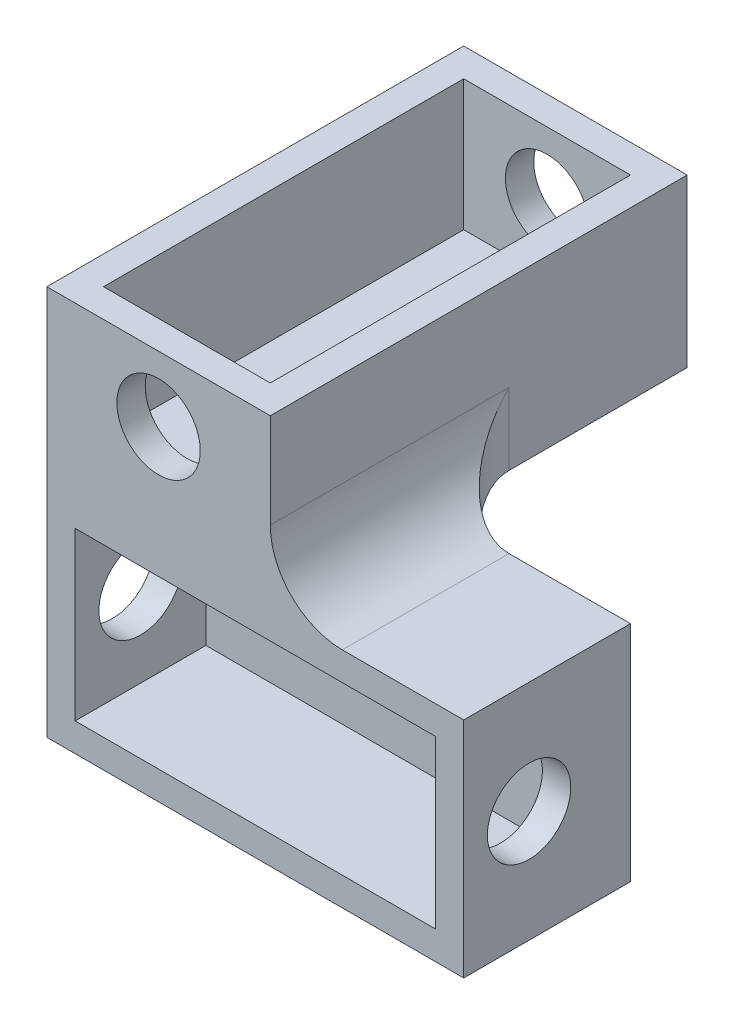
ISO-10303-21;
HEADER;
FILE_DESCRIPTION(('STEP AP214'),'2;1');
FILE_NAME('part.step','',(''),(''),'','','');
FILE_SCHEMA(('AUTOMOTIVE_DESIGN { 1 0 10303 214 1 1 1 1 }'));
ENDSEC;
DATA;
#1=APPLICATION_CONTEXT('core data for automotive mechanical design processes');
#2=APPLICATION_PROTOCOL_DEFINITION('international standard','automotive_design',2000,#1);
#3=PRODUCT_CONTEXT('',#1,'mechanical');
#4=PRODUCT('Part','Part','',(#3));
#5=PRODUCT_RELATED_PRODUCT_CATEGORY('part','',(#4));
#6=PRODUCT_DEFINITION_FORMATION('','',#4);
#7=PRODUCT_DEFINITION_CONTEXT('part definition',#1,'design');
#8=PRODUCT_DEFINITION('design','',#6,#7);
#9=PRODUCT_DEFINITION_SHAPE('','',#8);
#10=(LENGTH_UNIT() NAMED_UNIT(*) SI_UNIT(.MILLI.,.METRE.));
#11=(NAMED_UNIT(*) PLANE_ANGLE_UNIT() SI_UNIT($,.RADIAN.));
#12=(NAMED_UNIT(*) SI_UNIT($,.STERADIAN.) SOLID_ANGLE_UNIT());
#13=UNCERTAINTY_MEASURE_WITH_UNIT(LENGTH_MEASURE(1.E-05),#10,'distance_accuracy_value','');
#14=(GEOMETRIC_REPRESENTATION_CONTEXT(3) GLOBAL_UNCERTAINTY_ASSIGNED_CONTEXT((#13)) GLOBAL_UNIT_ASSIGNED_CONTEXT((#10,
#11,#12)) REPRESENTATION_CONTEXT('',''));
#15=CARTESIAN_POINT('',(0.,0.,0.));
#16=DIRECTION('',(0.,0.,1.));
#17=DIRECTION('',(1.,0.,0.));
#18=AXIS2_PLACEMENT_3D('',#15,#16,#17);
#19=CARTESIAN_POINT('',(-15.875,7.350000032,-3.425));
#20=DIRECTION('',(0.,-1.,0.));
#21=DIRECTION('',(0.,0.,-1.));
#22=AXIS2_PLACEMENT_3D('',#19,#20,#21);
#23=PLANE('',#22);
#24=DIRECTION('',(-1.,0.,0.));
#25=VECTOR('',#24,1.);
#26=CARTESIAN_POINT('',(-15.875,7.350000032,-14.95));
#27=LINE('',#26,#25);
#28=CARTESIAN_POINT('',(15.875,7.350000032,-14.95));
#29=VERTEX_POINT('',#28);
#30=CARTESIAN_POINT('',(-15.875,7.350000032,-14.95));
#31=VERTEX_POINT('',#30);
#32=EDGE_CURVE('E313',#29,#31,#27,.T.);
#33=ORIENTED_EDGE('',*,*,#32,.F.);
#34=DIRECTION('',(0.,0.,-1.));
#35=VECTOR('',#34,1.);
#36=CARTESIAN_POINT('',(15.875,7.350000032,-3.425));
#37=LINE('',#36,#35);
#38=CARTESIAN_POINT('',(15.875,7.350000032,-3.425));
#39=VERTEX_POINT('',#38);
#40=EDGE_CURVE('E334',#39,#29,#37,.T.);
#41=ORIENTED_EDGE('',*,*,#40,.F.);
#42=DIRECTION('',(-1.,0.,0.));
#43=VECTOR('',#42,1.);
#44=CARTESIAN_POINT('',(-15.875,7.350000032,-3.425));
#45=LINE('',#44,#43);
#46=CARTESIAN_POINT('',(-15.875,7.350000032,-3.425));
#47=VERTEX_POINT('',#46);
#48=EDGE_CURVE('E298',#39,#47,#45,.T.);
#49=ORIENTED_EDGE('',*,*,#48,.T.);
#50=DIRECTION('',(0.,0.,-1.));
#51=VECTOR('',#50,1.);
#52=CARTESIAN_POINT('',(-15.875,7.350000032,-3.425));
#53=LINE('',#52,#51);
#54=EDGE_CURVE('E331',#47,#31,#53,.T.);
#55=ORIENTED_EDGE('',*,*,#54,.T.);
#56=EDGE_LOOP('',(#33,#41,#49,#55));
#57=FACE_BOUND('',#56,.T.);
#58=ADVANCED_FACE('F42',(#57),#23,.T.);
#59=CARTESIAN_POINT('',(-15.875,-7.350000032,-3.425));
#60=DIRECTION('',(0.,1.,0.));
#61=DIRECTION('',(0.,0.,1.));
#62=AXIS2_PLACEMENT_3D('',#59,#60,#61);
#63=PLANE('',#62);
#64=DIRECTION('',(1.,0.,0.));
#65=VECTOR('',#64,1.);
#66=CARTESIAN_POINT('',(-15.875,-7.350000032,-14.95));
#67=LINE('',#66,#65);
#68=CARTESIAN_POINT('',(-15.875,-7.350000032,-14.95));
#69=VERTEX_POINT('',#68);
#70=CARTESIAN_POINT('',(15.875,-7.350000032,-14.95));
#71=VERTEX_POINT('',#70);
#72=EDGE_CURVE('E299',#69,#71,#67,.T.);
#73=ORIENTED_EDGE('',*,*,#72,.F.);
#74=DIRECTION('',(0.,0.,-1.));
#75=VECTOR('',#74,1.);
#76=CARTESIAN_POINT('',(-15.875,-7.350000032,-3.425));
#77=LINE('',#76,#75);
#78=CARTESIAN_POINT('',(-15.875,-7.350000032,-3.425));
#79=VERTEX_POINT('',#78);
#80=EDGE_CURVE('E327',#79,#69,#77,.T.);
#81=ORIENTED_EDGE('',*,*,#80,.F.);
#82=DIRECTION('',(1.,0.,0.));
#83=VECTOR('',#82,1.);
#84=CARTESIAN_POINT('',(-15.875,-7.350000032,-3.425));
#85=LINE('',#84,#83);
#86=CARTESIAN_POINT('',(15.875,-7.350000032,-3.425));
#87=VERTEX_POINT('',#86);
#88=EDGE_CURVE('E306',#79,#87,#85,.T.);
#89=ORIENTED_EDGE('',*,*,#88,.T.);
#90=DIRECTION('',(0.,0.,-1.));
#91=VECTOR('',#90,1.);
#92=CARTESIAN_POINT('',(15.875,-7.350000032,-3.425));
#93=LINE('',#92,#91);
#94=EDGE_CURVE('E309',#87,#71,#93,.T.);
#95=ORIENTED_EDGE('',*,*,#94,.T.);
#96=EDGE_LOOP('',(#73,#81,#89,#95));
#97=FACE_BOUND('',#96,.T.);
#98=ADVANCED_FACE('F481',(#97),#63,.T.);
#99=CARTESIAN_POINT('',(0.,0.,-14.95));
#100=DIRECTION('',(0.,0.,1.));
#101=DIRECTION('',(1.,0.,0.));
#102=AXIS2_PLACEMENT_3D('',#99,#100,#101);
#103=PLANE('',#102);
#104=DIRECTION('',(0.,-1.,0.));
#105=VECTOR('',#104,1.);
#106=CARTESIAN_POINT('',(-15.875,-7.350000032,-14.95));
#107=LINE('',#106,#105);
#108=EDGE_CURVE('E317',#31,#69,#107,.T.);
#109=ORIENTED_EDGE('',*,*,#108,.T.);
#110=ORIENTED_EDGE('',*,*,#72,.T.);
#111=DIRECTION('',(0.,1.,0.));
#112=VECTOR('',#111,1.);
#113=CARTESIAN_POINT('',(15.875,-7.350000032,-14.95));
#114=LINE('',#113,#112);
#115=EDGE_CURVE('E294',#71,#29,#114,.T.);
#116=ORIENTED_EDGE('',*,*,#115,.T.);
#117=ORIENTED_EDGE('',*,*,#32,.T.);
#118=EDGE_LOOP('',(#109,#110,#116,#117));
#119=FACE_BOUND('',#118,.T.);
#120=ADVANCED_FACE('F483',(#119),#103,.T.);
#121=CARTESIAN_POINT('',(0.,0.,-3.425));
#122=DIRECTION('',(0.,0.,-1.));
#123=DIRECTION('',(-1.,0.,0.));
#124=AXIS2_PLACEMENT_3D('',#121,#122,#123);
#125=PLANE('',#124);
#126=DIRECTION('',(0.,1.,0.));
#127=VECTOR('',#126,1.);
#128=CARTESIAN_POINT('',(18.375,-9.850000032,-3.425));
#129=LINE('',#128,#127);
#130=CARTESIAN_POINT('',(18.375,-9.850000032,-3.425));
#131=VERTEX_POINT('',#130);
#132=CARTESIAN_POINT('',(18.375,9.850000032,-3.425));
#133=VERTEX_POINT('',#132);
#134=EDGE_CURVE('E338',#131,#133,#129,.T.);
#135=ORIENTED_EDGE('',*,*,#134,.T.);
#136=DIRECTION('',(-1.,0.,0.));
#137=VECTOR('',#136,1.);
#138=CARTESIAN_POINT('',(-18.375,9.850000032,-3.425));
#139=LINE('',#138,#137);
#140=CARTESIAN_POINT('',(7.675000064,9.850000032,-3.425));
#141=VERTEX_POINT('',#140);
#142=EDGE_CURVE('E342',#133,#141,#139,.T.);
#143=ORIENTED_EDGE('',*,*,#142,.T.);
#144=CARTESIAN_POINT('',(7.675000064,16.200000032,-3.425));
#145=DIRECTION('',(0.,0.,-1.));
#146=DIRECTION('',(-1.,0.,0.));
#147=AXIS2_PLACEMENT_3D('',#144,#145,#146);
#148=CIRCLE('',#147,6.35);
#149=CARTESIAN_POINT('',(1.325000064,16.200000032,-3.42500000000001));
#150=VERTEX_POINT('',#149);
#151=EDGE_CURVE('E390',#141,#150,#148,.T.);
#152=ORIENTED_EDGE('',*,*,#151,.T.);
#153=DIRECTION('',(0.,-1.,0.));
#154=VECTOR('',#153,1.);
#155=CARTESIAN_POINT('',(1.325000064,24.550000032,-3.42500000000001));
#156=LINE('',#155,#154);
#157=CARTESIAN_POINT('',(1.325000064,24.550000032,-3.42500000000001));
#158=VERTEX_POINT('',#157);
#159=EDGE_CURVE('E181',#158,#150,#156,.T.);
#160=ORIENTED_EDGE('',*,*,#159,.F.);
#161=DIRECTION('',(1.,0.,0.));
#162=VECTOR('',#161,1.);
#163=CARTESIAN_POINT('',(1.325000064,24.550000032,-3.42500000000001));
#164=LINE('',#163,#162);
#165=CARTESIAN_POINT('',(-18.375,24.550000032,-3.42500000000001));
#166=VERTEX_POINT('',#165);
#167=EDGE_CURVE('E257',#166,#158,#164,.T.);
#168=ORIENTED_EDGE('',*,*,#167,.F.);
#169=DIRECTION('',(0.,-1.,0.));
#170=VECTOR('',#169,1.);
#171=CARTESIAN_POINT('',(-18.375,-9.850000032,-3.425));
#172=LINE('',#171,#170);
#173=CARTESIAN_POINT('',(-18.375,-9.850000032,-3.425));
#174=VERTEX_POINT('',#173);
#175=EDGE_CURVE('E346',#166,#174,#172,.T.);
#176=ORIENTED_EDGE('',*,*,#175,.T.);
#177=DIRECTION('',(1.,0.,0.));
#178=VECTOR('',#177,1.);
#179=CARTESIAN_POINT('',(-18.375,-9.850000032,-3.425));
#180=LINE('',#179,#178);
#181=EDGE_CURVE('E349',#174,#131,#180,.T.);
#182=ORIENTED_EDGE('',*,*,#181,.T.);
#183=EDGE_LOOP('',(#135,#143,#152,#160,#168,#176,#182));
#184=FACE_BOUND('',#183,.T.);
#185=DIRECTION('',(0.,1.,0.));
#186=VECTOR('',#185,1.);
#187=CARTESIAN_POINT('',(15.875,-7.350000032,-3.425));
#188=LINE('',#187,#186);
#189=EDGE_CURVE('E295',#87,#39,#188,.T.);
#190=ORIENTED_EDGE('',*,*,#189,.F.);
#191=ORIENTED_EDGE('',*,*,#88,.F.);
#192=DIRECTION('',(0.,-1.,0.));
#193=VECTOR('',#192,1.);
#194=CARTESIAN_POINT('',(-15.875,-7.350000032,-3.425));
#195=LINE('',#194,#193);
#196=EDGE_CURVE('E302',#47,#79,#195,.T.);
#197=ORIENTED_EDGE('',*,*,#196,.F.);
#198=ORIENTED_EDGE('',*,*,#48,.F.);
#199=EDGE_LOOP('',(#190,#191,#197,#198));
#200=FACE_BOUND('',#199,.T.);
#201=CARTESIAN_POINT('',(-8.524999968,18.787500032,-3.42500000000001));
#202=DIRECTION('',(0.,0.,-1.));
#203=DIRECTION('',(0.,-1.,0.));
#204=AXIS2_PLACEMENT_3D('',#201,#202,#203);
#205=CIRCLE('',#204,3.675);
#206=CARTESIAN_POINT('',(-8.524999968,15.112500032,-3.42500000000001));
#207=VERTEX_POINT('',#206);
#208=EDGE_CURVE('E198',#207,#207,#205,.T.);
#209=ORIENTED_EDGE('',*,*,#208,.T.);
#210=EDGE_LOOP('',(#209));
#211=FACE_BOUND('',#210,.T.);
#212=ADVANCED_FACE('F417',(#184,#200,#211),#125,.F.);
#213=CARTESIAN_POINT('',(-18.375,9.850000032,-3.425));
#214=DIRECTION('',(0.,-1.,0.));
#215=DIRECTION('',(0.,0.,-1.));
#216=AXIS2_PLACEMENT_3D('',#213,#214,#215);
#217=PLANE('',#216);
#218=DIRECTION('',(1.,0.,0.));
#219=VECTOR('',#218,1.);
#220=CARTESIAN_POINT('',(-18.375,9.850000032,-18.125));
#221=LINE('',#220,#219);
#222=CARTESIAN_POINT('',(7.675000064,9.850000032,-18.125));
#223=VERTEX_POINT('',#222);
#224=CARTESIAN_POINT('',(18.375,9.850000032,-18.125));
#225=VERTEX_POINT('',#224);
#226=EDGE_CURVE('E291',#223,#225,#221,.T.);
#227=ORIENTED_EDGE('',*,*,#226,.F.);
#228=DIRECTION('',(0.,0.,1.));
#229=VECTOR('',#228,1.);
#230=CARTESIAN_POINT('',(7.675000064,9.850000032,-3.425));
#231=LINE('',#230,#229);
#232=EDGE_CURVE('E384',#223,#141,#231,.T.);
#233=ORIENTED_EDGE('',*,*,#232,.T.);
#234=ORIENTED_EDGE('',*,*,#142,.F.);
#235=DIRECTION('',(0.,0.,-1.));
#236=VECTOR('',#235,1.);
#237=CARTESIAN_POINT('',(18.375,9.850000032,-3.425));
#238=LINE('',#237,#236);
#239=EDGE_CURVE('E358',#133,#225,#238,.T.);
#240=ORIENTED_EDGE('',*,*,#239,.T.);
#241=EDGE_LOOP('',(#227,#233,#234,#240));
#242=FACE_BOUND('',#241,.T.);
#243=ADVANCED_FACE('F421',(#242),#217,.F.);
#244=CARTESIAN_POINT('',(0.,0.,-18.125));
#245=DIRECTION('',(0.,0.,1.));
#246=DIRECTION('',(1.,0.,0.));
#247=AXIS2_PLACEMENT_3D('',#244,#245,#246);
#248=PLANE('',#247);
#249=DIRECTION('',(1.,0.,0.));
#250=VECTOR('',#249,1.);
#251=CARTESIAN_POINT('',(1.325000064,3.500000032,-18.125));
#252=LINE('',#251,#250);
#253=CARTESIAN_POINT('',(-18.375,3.500000032,-18.125));
#254=VERTEX_POINT('',#253);
#255=CARTESIAN_POINT('',(7.675000064,3.500000032,-18.125));
#256=VERTEX_POINT('',#255);
#257=EDGE_CURVE('E66',#254,#256,#252,.T.);
#258=ORIENTED_EDGE('',*,*,#257,.T.);
#259=DIRECTION('',(0.,1.,0.));
#260=VECTOR('',#259,1.);
#261=CARTESIAN_POINT('',(7.675000064,16.200000032,-18.125));
#262=LINE('',#261,#260);
#263=EDGE_CURVE('E393',#256,#223,#262,.T.);
#264=ORIENTED_EDGE('',*,*,#263,.T.);
#265=ORIENTED_EDGE('',*,*,#226,.T.);
#266=DIRECTION('',(0.,-1.,0.));
#267=VECTOR('',#266,1.);
#268=CARTESIAN_POINT('',(18.375,9.850000032,-18.125));
#269=LINE('',#268,#267);
#270=CARTESIAN_POINT('',(18.375,-9.850000032,-18.125));
#271=VERTEX_POINT('',#270);
#272=EDGE_CURVE('E279',#225,#271,#269,.T.);
#273=ORIENTED_EDGE('',*,*,#272,.T.);
#274=DIRECTION('',(-1.,0.,0.));
#275=VECTOR('',#274,1.);
#276=CARTESIAN_POINT('',(-18.375,-9.850000032,-18.125));
#277=LINE('',#276,#275);
#278=CARTESIAN_POINT('',(-18.375,-9.850000032,-18.125));
#279=VERTEX_POINT('',#278);
#280=EDGE_CURVE('E283',#271,#279,#277,.T.);
#281=ORIENTED_EDGE('',*,*,#280,.T.);
#282=DIRECTION('',(0.,1.,0.));
#283=VECTOR('',#282,1.);
#284=CARTESIAN_POINT('',(-18.375,9.850000032,-18.125));
#285=LINE('',#284,#283);
#286=EDGE_CURVE('E288',#279,#254,#285,.T.);
#287=ORIENTED_EDGE('',*,*,#286,.T.);
#288=EDGE_LOOP('',(#258,#264,#265,#273,#281,#287));
#289=FACE_BOUND('',#288,.T.);
#290=ADVANCED_FACE('F424',(#289),#248,.F.);
#291=CARTESIAN_POINT('',(-18.375,-9.850000032,-3.425));
#292=DIRECTION('',(0.,1.,0.));
#293=DIRECTION('',(0.,0.,1.));
#294=AXIS2_PLACEMENT_3D('',#291,#292,#293);
#295=PLANE('',#294);
#296=DIRECTION('',(0.,0.,-1.));
#297=VECTOR('',#296,1.);
#298=CARTESIAN_POINT('',(-18.375,-9.850000032,-3.425));
#299=LINE('',#298,#297);
#300=EDGE_CURVE('E355',#174,#279,#299,.T.);
#301=ORIENTED_EDGE('',*,*,#300,.T.);
#302=ORIENTED_EDGE('',*,*,#280,.F.);
#303=DIRECTION('',(0.,0.,-1.));
#304=VECTOR('',#303,1.);
#305=CARTESIAN_POINT('',(18.375,-9.850000032,-3.425));
#306=LINE('',#305,#304);
#307=EDGE_CURVE('E352',#131,#271,#306,.T.);
#308=ORIENTED_EDGE('',*,*,#307,.F.);
#309=ORIENTED_EDGE('',*,*,#181,.F.);
#310=EDGE_LOOP('',(#301,#302,#308,#309));
#311=FACE_BOUND('',#310,.T.);
#312=ADVANCED_FACE('F432',(#311),#295,.F.);
#313=CARTESIAN_POINT('',(18.375,-9.850000032,-3.425));
#314=DIRECTION('',(-1.,0.,0.));
#315=DIRECTION('',(0.,0.,1.));
#316=AXIS2_PLACEMENT_3D('',#313,#314,#315);
#317=PLANE('',#316);
#318=CARTESIAN_POINT('',(18.375,0.,-9.18750000000001));
#319=DIRECTION('',(-1.,0.,0.));
#320=DIRECTION('',(0.,0.,1.));
#321=AXIS2_PLACEMENT_3D('',#318,#319,#320);
#322=CIRCLE('',#321,3.675);
#323=CARTESIAN_POINT('',(18.375,0.,-5.51250000000001));
#324=VERTEX_POINT('',#323);
#325=EDGE_CURVE('E267',#324,#324,#322,.T.);
#326=ORIENTED_EDGE('',*,*,#325,.T.);
#327=EDGE_LOOP('',(#326));
#328=FACE_BOUND('',#327,.T.);
#329=ORIENTED_EDGE('',*,*,#307,.T.);
#330=ORIENTED_EDGE('',*,*,#272,.F.);
#331=ORIENTED_EDGE('',*,*,#239,.F.);
#332=ORIENTED_EDGE('',*,*,#134,.F.);
#333=EDGE_LOOP('',(#329,#330,#331,#332));
#334=FACE_BOUND('',#333,.T.);
#335=ADVANCED_FACE('F427',(#328,#334),#317,.F.);
#336=CARTESIAN_POINT('',(15.875,-7.350000032,-3.425));
#337=DIRECTION('',(-1.,0.,0.));
#338=DIRECTION('',(0.,0.,1.));
#339=AXIS2_PLACEMENT_3D('',#336,#337,#338);
#340=PLANE('',#339);
#341=CARTESIAN_POINT('',(15.875,0.,-9.18750000000001));
#342=DIRECTION('',(-1.,0.,0.));
#343=DIRECTION('',(0.,0.,1.));
#344=AXIS2_PLACEMENT_3D('',#341,#342,#343);
#345=CIRCLE('',#344,3.675);
#346=CARTESIAN_POINT('',(15.875,0.,-5.51250000000001));
#347=VERTEX_POINT('',#346);
#348=EDGE_CURVE('E362',#347,#347,#345,.T.);
#349=ORIENTED_EDGE('',*,*,#348,.F.);
#350=EDGE_LOOP('',(#349));
#351=FACE_BOUND('',#350,.T.);
#352=ORIENTED_EDGE('',*,*,#115,.F.);
#353=ORIENTED_EDGE('',*,*,#94,.F.);
#354=ORIENTED_EDGE('',*,*,#189,.T.);
#355=ORIENTED_EDGE('',*,*,#40,.T.);
#356=EDGE_LOOP('',(#352,#353,#354,#355));
#357=FACE_BOUND('',#356,.T.);
#358=ADVANCED_FACE('F439',(#351,#357),#340,.T.);
#359=CARTESIAN_POINT('',(18.375,0.,-9.18750000000001));
#360=DIRECTION('',(-1.,0.,0.));
#361=DIRECTION('',(0.,0.,1.));
#362=AXIS2_PLACEMENT_3D('',#359,#360,#361);
#363=CYLINDRICAL_SURFACE('',#362,3.675);
#364=ORIENTED_EDGE('',*,*,#325,.F.);
#365=EDGE_LOOP('',(#364));
#366=FACE_BOUND('',#365,.T.);
#367=ORIENTED_EDGE('',*,*,#348,.T.);
#368=EDGE_LOOP('',(#367));
#369=FACE_BOUND('',#368,.T.);
#370=ADVANCED_FACE('F451',(#366,#369),#363,.F.);
#371=CARTESIAN_POINT('',(-18.375,-9.850000032,-3.425));
#372=DIRECTION('',(1.,0.,0.));
#373=DIRECTION('',(0.,0.,-1.));
#374=AXIS2_PLACEMENT_3D('',#371,#372,#373);
#375=PLANE('',#374);
#376=CARTESIAN_POINT('',(-18.375,0.,-9.18750000000001));
#377=DIRECTION('',(1.,0.,0.));
#378=DIRECTION('',(0.,0.,-1.));
#379=AXIS2_PLACEMENT_3D('',#376,#377,#378);
#380=CIRCLE('',#379,3.675);
#381=CARTESIAN_POINT('',(-18.375,0.,-12.8625));
#382=VERTEX_POINT('',#381);
#383=EDGE_CURVE('E284',#382,#382,#380,.T.);
#384=ORIENTED_EDGE('',*,*,#383,.T.);
#385=EDGE_LOOP('',(#384));
#386=FACE_BOUND('',#385,.T.);
#387=ORIENTED_EDGE('',*,*,#175,.F.);
#388=DIRECTION('',(0.,0.,1.));
#389=VECTOR('',#388,1.);
#390=CARTESIAN_POINT('',(-18.375,24.550000032,-3.42500000000001));
#391=LINE('',#390,#389);
#392=CARTESIAN_POINT('',(-18.375,24.550000032,-40.175));
#393=VERTEX_POINT('',#392);
#394=EDGE_CURVE('E253',#393,#166,#391,.T.);
#395=ORIENTED_EDGE('',*,*,#394,.F.);
#396=DIRECTION('',(0.,-1.,0.));
#397=VECTOR('',#396,1.);
#398=CARTESIAN_POINT('',(-18.375,24.550000032,-40.175));
#399=LINE('',#398,#397);
#400=CARTESIAN_POINT('',(-18.375,9.850000032,-40.175));
#401=VERTEX_POINT('',#400);
#402=EDGE_CURVE('E264',#393,#401,#399,.T.);
#403=ORIENTED_EDGE('',*,*,#402,.T.);
#404=DIRECTION('',(0.,0.,-1.));
#405=VECTOR('',#404,1.);
#406=CARTESIAN_POINT('',(-18.375,9.850000032,-3.425));
#407=LINE('',#406,#405);
#408=CARTESIAN_POINT('',(-18.375,9.850000032,-24.475));
#409=VERTEX_POINT('',#408);
#410=EDGE_CURVE('E192',#409,#401,#407,.T.);
#411=ORIENTED_EDGE('',*,*,#410,.F.);
#412=CARTESIAN_POINT('',(-18.375,3.500000032,-24.475));
#413=DIRECTION('',(1.,0.,0.));
#414=DIRECTION('',(0.,0.,-1.));
#415=AXIS2_PLACEMENT_3D('',#412,#413,#414);
#416=CIRCLE('',#415,6.35);
#417=EDGE_CURVE('E381',#409,#254,#416,.T.);
#418=ORIENTED_EDGE('',*,*,#417,.T.);
#419=ORIENTED_EDGE('',*,*,#286,.F.);
#420=ORIENTED_EDGE('',*,*,#300,.F.);
#421=EDGE_LOOP('',(#387,#395,#403,#411,#418,#419,#420));
#422=FACE_BOUND('',#421,.T.);
#423=ADVANCED_FACE('F408',(#386,#422),#375,.F.);
#424=CARTESIAN_POINT('',(-15.875,-7.350000032,-3.425));
#425=DIRECTION('',(1.,0.,0.));
#426=DIRECTION('',(0.,0.,-1.));
#427=AXIS2_PLACEMENT_3D('',#424,#425,#426);
#428=PLANE('',#427);
#429=CARTESIAN_POINT('',(-15.875,0.,-9.18750000000001));
#430=DIRECTION('',(1.,0.,0.));
#431=DIRECTION('',(0.,0.,-1.));
#432=AXIS2_PLACEMENT_3D('',#429,#430,#431);
#433=CIRCLE('',#432,3.675);
#434=CARTESIAN_POINT('',(-15.875,0.,-12.8625));
#435=VERTEX_POINT('',#434);
#436=EDGE_CURVE('E366',#435,#435,#433,.T.);
#437=ORIENTED_EDGE('',*,*,#436,.F.);
#438=EDGE_LOOP('',(#437));
#439=FACE_BOUND('',#438,.T.);
#440=ORIENTED_EDGE('',*,*,#108,.F.);
#441=ORIENTED_EDGE('',*,*,#54,.F.);
#442=ORIENTED_EDGE('',*,*,#196,.T.);
#443=ORIENTED_EDGE('',*,*,#80,.T.);
#444=EDGE_LOOP('',(#440,#441,#442,#443));
#445=FACE_BOUND('',#444,.T.);
#446=ADVANCED_FACE('F448',(#439,#445),#428,.T.);
#447=ORIENTED_EDGE('',*,*,#436,.T.);
#448=EDGE_LOOP('',(#447));
#449=FACE_BOUND('',#448,.T.);
#450=ORIENTED_EDGE('',*,*,#383,.F.);
#451=EDGE_LOOP('',(#450));
#452=FACE_BOUND('',#451,.T.);
#453=ADVANCED_FACE('F445',(#449,#452),#363,.F.);
#454=CARTESIAN_POINT('',(-15.875,24.550000032,-5.92500000000001));
#455=DIRECTION('',(1.,0.,0.));
#456=DIRECTION('',(0.,-1.,0.));
#457=AXIS2_PLACEMENT_3D('',#454,#455,#456);
#458=PLANE('',#457);
#459=DIRECTION('',(0.,0.,1.));
#460=VECTOR('',#459,1.);
#461=CARTESIAN_POINT('',(-15.875,13.025000032,-5.92500000000001));
#462=LINE('',#461,#460);
#463=CARTESIAN_POINT('',(-15.875,13.025000032,-37.675));
#464=VERTEX_POINT('',#463);
#465=CARTESIAN_POINT('',(-15.875,13.025000032,-5.92500000000001));
#466=VERTEX_POINT('',#465);
#467=EDGE_CURVE('E226',#464,#466,#462,.T.);
#468=ORIENTED_EDGE('',*,*,#467,.F.);
#469=DIRECTION('',(0.,-1.,0.));
#470=VECTOR('',#469,1.);
#471=CARTESIAN_POINT('',(-15.875,24.550000032,-37.675));
#472=LINE('',#471,#470);
#473=CARTESIAN_POINT('',(-15.875,24.550000032,-37.675));
#474=VERTEX_POINT('',#473);
#475=EDGE_CURVE('E247',#474,#464,#472,.T.);
#476=ORIENTED_EDGE('',*,*,#475,.F.);
#477=DIRECTION('',(0.,0.,1.));
#478=VECTOR('',#477,1.);
#479=CARTESIAN_POINT('',(-15.875,24.550000032,-5.92500000000001));
#480=LINE('',#479,#478);
#481=CARTESIAN_POINT('',(-15.875,24.550000032,-5.92500000000001));
#482=VERTEX_POINT('',#481);
#483=EDGE_CURVE('E211',#474,#482,#480,.T.);
#484=ORIENTED_EDGE('',*,*,#483,.T.);
#485=DIRECTION('',(0.,-1.,0.));
#486=VECTOR('',#485,1.);
#487=CARTESIAN_POINT('',(-15.875,24.550000032,-5.92500000000001));
#488=LINE('',#487,#486);
#489=EDGE_CURVE('E244',#482,#466,#488,.T.);
#490=ORIENTED_EDGE('',*,*,#489,.T.);
#491=EDGE_LOOP('',(#468,#476,#484,#490));
#492=FACE_BOUND('',#491,.T.);
#493=ADVANCED_FACE('F447',(#492),#458,.T.);
#494=CARTESIAN_POINT('',(-1.174999936,24.550000032,-5.92500000000001));
#495=DIRECTION('',(-1.,0.,0.));
#496=DIRECTION('',(0.,1.,0.));
#497=AXIS2_PLACEMENT_3D('',#494,#495,#496);
#498=PLANE('',#497);
#499=DIRECTION('',(0.,0.,-1.));
#500=VECTOR('',#499,1.);
#501=CARTESIAN_POINT('',(-1.174999936,13.025000032,-5.92500000000001));
#502=LINE('',#501,#500);
#503=CARTESIAN_POINT('',(-1.174999936,13.025000032,-5.92500000000001));
#504=VERTEX_POINT('',#503);
#505=CARTESIAN_POINT('',(-1.174999936,13.025000032,-37.675));
#506=VERTEX_POINT('',#505);
#507=EDGE_CURVE('E212',#504,#506,#502,.T.);
#508=ORIENTED_EDGE('',*,*,#507,.F.);
#509=DIRECTION('',(0.,-1.,0.));
#510=VECTOR('',#509,1.);
#511=CARTESIAN_POINT('',(-1.174999936,24.550000032,-5.92500000000001));
#512=LINE('',#511,#510);
#513=CARTESIAN_POINT('',(-1.174999936,24.550000032,-5.92500000000001));
#514=VERTEX_POINT('',#513);
#515=EDGE_CURVE('E240',#514,#504,#512,.T.);
#516=ORIENTED_EDGE('',*,*,#515,.F.);
#517=DIRECTION('',(0.,0.,-1.));
#518=VECTOR('',#517,1.);
#519=CARTESIAN_POINT('',(-1.174999936,24.550000032,-5.92500000000001));
#520=LINE('',#519,#518);
#521=CARTESIAN_POINT('',(-1.174999936,24.550000032,-37.675));
#522=VERTEX_POINT('',#521);
#523=EDGE_CURVE('E219',#514,#522,#520,.T.);
#524=ORIENTED_EDGE('',*,*,#523,.T.);
#525=DIRECTION('',(0.,-1.,0.));
#526=VECTOR('',#525,1.);
#527=CARTESIAN_POINT('',(-1.174999936,24.550000032,-37.675));
#528=LINE('',#527,#526);
#529=EDGE_CURVE('E222',#522,#506,#528,.T.);
#530=ORIENTED_EDGE('',*,*,#529,.T.);
#531=EDGE_LOOP('',(#508,#516,#524,#530));
#532=FACE_BOUND('',#531,.T.);
#533=ADVANCED_FACE('F456',(#532),#498,.T.);
#534=CARTESIAN_POINT('',(-8.524999968,13.025000032,-21.8));
#535=DIRECTION('',(0.,1.,0.));
#536=DIRECTION('',(0.,0.,-1.));
#537=AXIS2_PLACEMENT_3D('',#534,#535,#536);
#538=PLANE('',#537);
#539=DIRECTION('',(1.,0.,0.));
#540=VECTOR('',#539,1.);
#541=CARTESIAN_POINT('',(-1.174999936,13.025000032,-5.92500000000001));
#542=LINE('',#541,#540);
#543=EDGE_CURVE('E230',#466,#504,#542,.T.);
#544=ORIENTED_EDGE('',*,*,#543,.T.);
#545=ORIENTED_EDGE('',*,*,#507,.T.);
#546=DIRECTION('',(-1.,0.,0.));
#547=VECTOR('',#546,1.);
#548=CARTESIAN_POINT('',(-1.174999936,13.025000032,-37.675));
#549=LINE('',#548,#547);
#550=EDGE_CURVE('E207',#506,#464,#549,.T.);
#551=ORIENTED_EDGE('',*,*,#550,.T.);
#552=ORIENTED_EDGE('',*,*,#467,.T.);
#553=EDGE_LOOP('',(#544,#545,#551,#552));
#554=FACE_BOUND('',#553,.T.);
#555=ADVANCED_FACE('F530',(#554),#538,.T.);
#556=CARTESIAN_POINT('',(-8.524999968,24.550000032,-21.8));
#557=DIRECTION('',(0.,-1.,0.));
#558=DIRECTION('',(0.,0.,1.));
#559=AXIS2_PLACEMENT_3D('',#556,#557,#558);
#560=PLANE('',#559);
#561=DIRECTION('',(-1.,0.,0.));
#562=VECTOR('',#561,1.);
#563=CARTESIAN_POINT('',(1.325000064,24.550000032,-40.175));
#564=LINE('',#563,#562);
#565=CARTESIAN_POINT('',(1.325000064,24.550000032,-40.175));
#566=VERTEX_POINT('',#565);
#567=EDGE_CURVE('E178',#566,#393,#564,.T.);
#568=ORIENTED_EDGE('',*,*,#567,.T.);
#569=ORIENTED_EDGE('',*,*,#394,.T.);
#570=ORIENTED_EDGE('',*,*,#167,.T.);
#571=DIRECTION('',(0.,0.,-1.));
#572=VECTOR('',#571,1.);
#573=CARTESIAN_POINT('',(1.325000064,24.550000032,-3.42500000000001));
#574=LINE('',#573,#572);
#575=EDGE_CURVE('E182',#158,#566,#574,.T.);
#576=ORIENTED_EDGE('',*,*,#575,.T.);
#577=EDGE_LOOP('',(#568,#569,#570,#576));
#578=FACE_BOUND('',#577,.T.);
#579=DIRECTION('',(-1.,0.,0.));
#580=VECTOR('',#579,1.);
#581=CARTESIAN_POINT('',(-1.174999936,24.550000032,-37.675));
#582=LINE('',#581,#580);
#583=EDGE_CURVE('E208',#522,#474,#582,.T.);
#584=ORIENTED_EDGE('',*,*,#583,.F.);
#585=ORIENTED_EDGE('',*,*,#523,.F.);
#586=DIRECTION('',(1.,0.,0.));
#587=VECTOR('',#586,1.);
#588=CARTESIAN_POINT('',(-1.174999936,24.550000032,-5.92500000000001));
#589=LINE('',#588,#587);
#590=EDGE_CURVE('E215',#482,#514,#589,.T.);
#591=ORIENTED_EDGE('',*,*,#590,.F.);
#592=ORIENTED_EDGE('',*,*,#483,.F.);
#593=EDGE_LOOP('',(#584,#585,#591,#592));
#594=FACE_BOUND('',#593,.T.);
#595=ADVANCED_FACE('F413',(#578,#594),#560,.F.);
#596=CARTESIAN_POINT('',(-8.524999968,9.850000032,-21.8));
#597=DIRECTION('',(0.,1.,0.));
#598=DIRECTION('',(0.,0.,-1.));
#599=AXIS2_PLACEMENT_3D('',#596,#597,#598);
#600=PLANE('',#599);
#601=DIRECTION('',(0.,0.,1.));
#602=VECTOR('',#601,1.);
#603=CARTESIAN_POINT('',(1.325000064,9.850000032,-3.425));
#604=LINE('',#603,#602);
#605=CARTESIAN_POINT('',(1.325000064,9.850000032,-40.175));
#606=VERTEX_POINT('',#605);
#607=CARTESIAN_POINT('',(1.325000064,9.850000032,-24.475));
#608=VERTEX_POINT('',#607);
#609=EDGE_CURVE('E185',#606,#608,#604,.T.);
#610=ORIENTED_EDGE('',*,*,#609,.T.);
#611=DIRECTION('',(1.,0.,0.));
#612=VECTOR('',#611,1.);
#613=CARTESIAN_POINT('',(-18.375,9.850000032,-24.475));
#614=LINE('',#613,#612);
#615=EDGE_CURVE('E378',#608,#409,#614,.F.);
#616=ORIENTED_EDGE('',*,*,#615,.T.);
#617=ORIENTED_EDGE('',*,*,#410,.T.);
#618=DIRECTION('',(1.,0.,0.));
#619=VECTOR('',#618,1.);
#620=CARTESIAN_POINT('',(-18.375,9.850000032,-40.175));
#621=LINE('',#620,#619);
#622=EDGE_CURVE('E176',#401,#606,#621,.T.);
#623=ORIENTED_EDGE('',*,*,#622,.T.);
#624=EDGE_LOOP('',(#610,#616,#617,#623));
#625=FACE_BOUND('',#624,.T.);
#626=ADVANCED_FACE('F194',(#625),#600,.F.);
#627=CARTESIAN_POINT('',(1.325000064,24.550000032,-3.42500000000001));
#628=DIRECTION('',(-1.,0.,0.));
#629=DIRECTION('',(0.,1.,0.));
#630=AXIS2_PLACEMENT_3D('',#627,#628,#629);
#631=PLANE('',#630);
#632=DIRECTION('',(0.,0.,1.));
#633=VECTOR('',#632,1.);
#634=CARTESIAN_POINT('',(1.325000064,16.200000032,-18.125));
#635=LINE('',#634,#633);
#636=CARTESIAN_POINT('',(1.325000064,16.200000032,-24.475));
#637=VERTEX_POINT('',#636);
#638=EDGE_CURVE('E58',#150,#637,#635,.F.);
#639=ORIENTED_EDGE('',*,*,#638,.T.);
#640=DIRECTION('',(0.,1.,0.));
#641=VECTOR('',#640,1.);
#642=CARTESIAN_POINT('',(1.325000064,3.500000032,-24.475));
#643=LINE('',#642,#641);
#644=EDGE_CURVE('E188',#637,#608,#643,.F.);
#645=ORIENTED_EDGE('',*,*,#644,.T.);
#646=ORIENTED_EDGE('',*,*,#609,.F.);
#647=DIRECTION('',(0.,-1.,0.));
#648=VECTOR('',#647,1.);
#649=CARTESIAN_POINT('',(1.325000064,24.550000032,-40.175));
#650=LINE('',#649,#648);
#651=EDGE_CURVE('E171',#566,#606,#650,.T.);
#652=ORIENTED_EDGE('',*,*,#651,.F.);
#653=ORIENTED_EDGE('',*,*,#575,.F.);
#654=ORIENTED_EDGE('',*,*,#159,.T.);
#655=EDGE_LOOP('',(#639,#645,#646,#652,#653,#654));
#656=FACE_BOUND('',#655,.T.);
#657=ADVANCED_FACE('F186',(#656),#631,.F.);
#658=CARTESIAN_POINT('',(1.325000064,24.550000032,-40.175));
#659=DIRECTION('',(0.,0.,1.));
#660=DIRECTION('',(0.,1.,0.));
#661=AXIS2_PLACEMENT_3D('',#658,#659,#660);
#662=PLANE('',#661);
#663=CARTESIAN_POINT('',(-8.524999968,18.787500032,-40.175));
#664=DIRECTION('',(0.,0.,1.));
#665=DIRECTION('',(0.,1.,0.));
#666=AXIS2_PLACEMENT_3D('',#663,#664,#665);
#667=CIRCLE('',#666,3.675);
#668=CARTESIAN_POINT('',(-8.524999968,22.462500032,-40.175));
#669=VERTEX_POINT('',#668);
#670=EDGE_CURVE('E272',#669,#669,#667,.T.);
#671=ORIENTED_EDGE('',*,*,#670,.T.);
#672=EDGE_LOOP('',(#671));
#673=FACE_BOUND('',#672,.T.);
#674=ORIENTED_EDGE('',*,*,#651,.T.);
#675=ORIENTED_EDGE('',*,*,#622,.F.);
#676=ORIENTED_EDGE('',*,*,#402,.F.);
#677=ORIENTED_EDGE('',*,*,#567,.F.);
#678=EDGE_LOOP('',(#674,#675,#676,#677));
#679=FACE_BOUND('',#678,.T.);
#680=ADVANCED_FACE('F173',(#673,#679),#662,.F.);
#681=CARTESIAN_POINT('',(-1.174999936,24.550000032,-37.675));
#682=DIRECTION('',(0.,0.,1.));
#683=DIRECTION('',(0.,1.,0.));
#684=AXIS2_PLACEMENT_3D('',#681,#682,#683);
#685=PLANE('',#684);
#686=CARTESIAN_POINT('',(-8.524999968,18.787500032,-37.675));
#687=DIRECTION('',(0.,0.,1.));
#688=DIRECTION('',(0.,1.,0.));
#689=AXIS2_PLACEMENT_3D('',#686,#687,#688);
#690=CIRCLE('',#689,3.675);
#691=CARTESIAN_POINT('',(-8.524999968,22.462500032,-37.675));
#692=VERTEX_POINT('',#691);
#693=EDGE_CURVE('E202',#692,#692,#690,.T.);
#694=ORIENTED_EDGE('',*,*,#693,.F.);
#695=EDGE_LOOP('',(#694));
#696=FACE_BOUND('',#695,.T.);
#697=ORIENTED_EDGE('',*,*,#550,.F.);
#698=ORIENTED_EDGE('',*,*,#529,.F.);
#699=ORIENTED_EDGE('',*,*,#583,.T.);
#700=ORIENTED_EDGE('',*,*,#475,.T.);
#701=EDGE_LOOP('',(#697,#698,#699,#700));
#702=FACE_BOUND('',#701,.T.);
#703=ADVANCED_FACE('F513',(#696,#702),#685,.T.);
#704=CARTESIAN_POINT('',(-8.524999968,18.787500032,-40.175));
#705=DIRECTION('',(0.,0.,1.));
#706=DIRECTION('',(0.,1.,0.));
#707=AXIS2_PLACEMENT_3D('',#704,#705,#706);
#708=CYLINDRICAL_SURFACE('',#707,3.675);
#709=ORIENTED_EDGE('',*,*,#670,.F.);
#710=EDGE_LOOP('',(#709));
#711=FACE_BOUND('',#710,.T.);
#712=ORIENTED_EDGE('',*,*,#693,.T.);
#713=EDGE_LOOP('',(#712));
#714=FACE_BOUND('',#713,.T.);
#715=ADVANCED_FACE('F502',(#711,#714),#708,.F.);
#716=CARTESIAN_POINT('',(-1.174999936,24.550000032,-5.92500000000001));
#717=DIRECTION('',(0.,0.,-1.));
#718=DIRECTION('',(0.,-1.,0.));
#719=AXIS2_PLACEMENT_3D('',#716,#717,#718);
#720=PLANE('',#719);
#721=CARTESIAN_POINT('',(-8.524999968,18.787500032,-5.92500000000001));
#722=DIRECTION('',(0.,0.,-1.));
#723=DIRECTION('',(0.,-1.,0.));
#724=AXIS2_PLACEMENT_3D('',#721,#722,#723);
#725=CIRCLE('',#724,3.675);
#726=CARTESIAN_POINT('',(-8.524999968,15.112500032,-5.92500000000001));
#727=VERTEX_POINT('',#726);
#728=EDGE_CURVE('E271',#727,#727,#725,.T.);
#729=ORIENTED_EDGE('',*,*,#728,.F.);
#730=EDGE_LOOP('',(#729));
#731=FACE_BOUND('',#730,.T.);
#732=ORIENTED_EDGE('',*,*,#543,.F.);
#733=ORIENTED_EDGE('',*,*,#489,.F.);
#734=ORIENTED_EDGE('',*,*,#590,.T.);
#735=ORIENTED_EDGE('',*,*,#515,.T.);
#736=EDGE_LOOP('',(#732,#733,#734,#735));
#737=FACE_BOUND('',#736,.T.);
#738=ADVANCED_FACE('F499',(#731,#737),#720,.T.);
#739=ORIENTED_EDGE('',*,*,#728,.T.);
#740=EDGE_LOOP('',(#739));
#741=FACE_BOUND('',#740,.T.);
#742=ORIENTED_EDGE('',*,*,#208,.F.);
#743=EDGE_LOOP('',(#742));
#744=FACE_BOUND('',#743,.T.);
#745=ADVANCED_FACE('F493',(#741,#744),#708,.F.);
#746=CARTESIAN_POINT('',(0.,3.500000032,-24.475));
#747=DIRECTION('',(-1.,0.,0.));
#748=DIRECTION('',(0.,0.,1.));
#749=AXIS2_PLACEMENT_3D('',#746,#747,#748);
#750=CYLINDRICAL_SURFACE('',#749,6.35);
#751=ORIENTED_EDGE('',*,*,#417,.F.);
#752=ORIENTED_EDGE('',*,*,#615,.F.);
#753=CARTESIAN_POINT('',(7.675000064,3.500000032,-24.475));
#754=DIRECTION('',(-0.707106781186547,-0.707106781186547,0.));
#755=DIRECTION('',(-0.707106781186547,0.707106781186547,0.));
#756=AXIS2_PLACEMENT_3D('',#753,#754,#755);
#757=ELLIPSE('',#756,8.98025612106915,6.35);
#758=EDGE_CURVE('E11',#608,#256,#757,.F.);
#759=ORIENTED_EDGE('',*,*,#758,.T.);
#760=ORIENTED_EDGE('',*,*,#257,.F.);
#761=EDGE_LOOP('',(#751,#752,#759,#760));
#762=FACE_BOUND('',#761,.T.);
#763=ADVANCED_FACE('F406',(#762),#750,.F.);
#764=CARTESIAN_POINT('',(7.675000064,16.200000032,-3.425));
#765=DIRECTION('',(0.,0.,-1.));
#766=DIRECTION('',(-1.,0.,0.));
#767=AXIS2_PLACEMENT_3D('',#764,#765,#766);
#768=CYLINDRICAL_SURFACE('',#767,6.35);
#769=ORIENTED_EDGE('',*,*,#232,.F.);
#770=CARTESIAN_POINT('',(7.675000064,16.200000032,-24.475));
#771=DIRECTION('',(0.,-0.707106781186547,-0.707106781186547));
#772=DIRECTION('',(0.,0.707106781186547,-0.707106781186547));
#773=AXIS2_PLACEMENT_3D('',#770,#771,#772);
#774=ELLIPSE('',#773,8.98025612106915,6.35);
#775=EDGE_CURVE('E51',#223,#637,#774,.T.);
#776=ORIENTED_EDGE('',*,*,#775,.T.);
#777=ORIENTED_EDGE('',*,*,#638,.F.);
#778=ORIENTED_EDGE('',*,*,#151,.F.);
#779=EDGE_LOOP('',(#769,#776,#777,#778));
#780=FACE_BOUND('',#779,.T.);
#781=ADVANCED_FACE('F400',(#780),#768,.F.);
#782=CARTESIAN_POINT('',(7.675000064,0.,-24.475));
#783=DIRECTION('',(0.,-1.,0.));
#784=DIRECTION('',(0.,0.,-1.));
#785=AXIS2_PLACEMENT_3D('',#782,#783,#784);
#786=CYLINDRICAL_SURFACE('',#785,6.35);
#787=ORIENTED_EDGE('',*,*,#758,.F.);
#788=ORIENTED_EDGE('',*,*,#644,.F.);
#789=ORIENTED_EDGE('',*,*,#775,.F.);
#790=ORIENTED_EDGE('',*,*,#263,.F.);
#791=EDGE_LOOP('',(#787,#788,#789,#790));
#792=FACE_BOUND('',#791,.T.);
#793=ADVANCED_FACE('F44',(#792),#786,.F.);
#794=CLOSED_SHELL('',(#58,#98,#120,#212,#243,#290,#312,#335,#358,#370,#423,#446,#453,#493,#533,
#555,#595,#626,#657,#680,#703,#715,#738,#745,#763,#781,#793));
#795=MANIFOLD_SOLID_BREP('B2',#794);
#796=ADVANCED_BREP_SHAPE_REPRESENTATION('',(#18,#795),#14);
#797=SHAPE_DEFINITION_REPRESENTATION(#9,#796);
ENDSEC;
END-ISO-10303-21;
